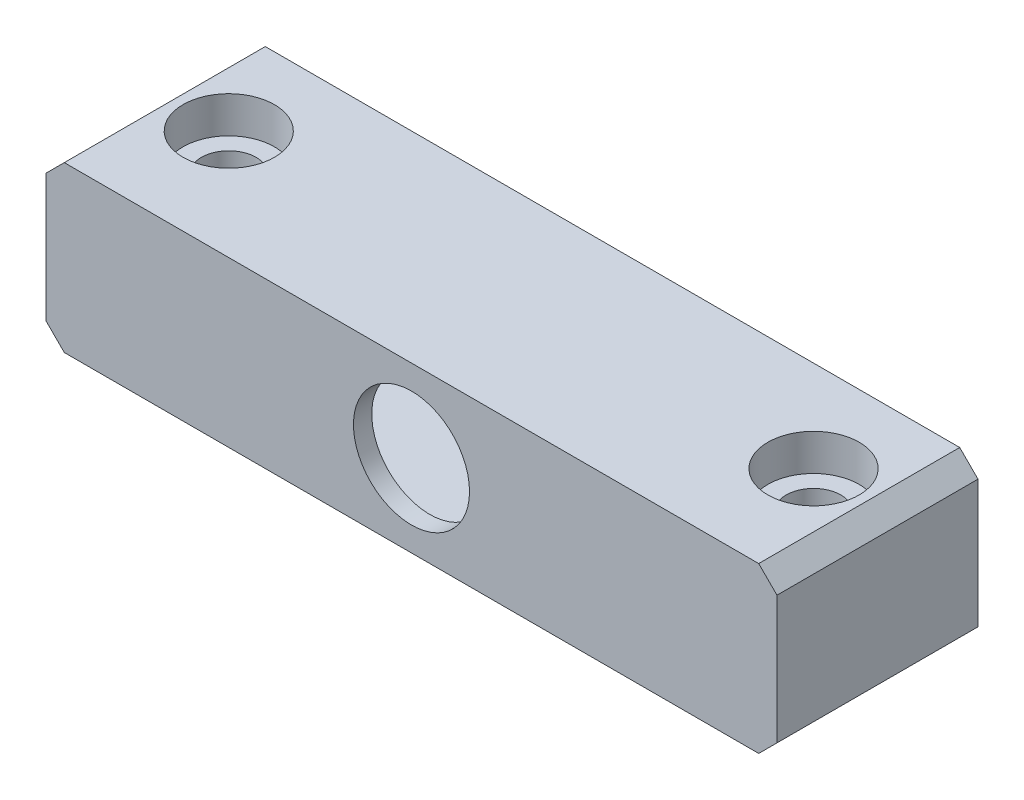
ISO-10303-21;
HEADER;
FILE_DESCRIPTION(('STEP AP214'),'2;1');
FILE_NAME('part.step','',(''),(''),'','','');
FILE_SCHEMA(('AUTOMOTIVE_DESIGN { 1 0 10303 214 1 1 1 1 }'));
ENDSEC;
DATA;
#1=APPLICATION_CONTEXT('core data for automotive mechanical design processes');
#2=APPLICATION_PROTOCOL_DEFINITION('international standard','automotive_design',2000,#1);
#3=PRODUCT_CONTEXT('',#1,'mechanical');
#4=PRODUCT('Part','Part','',(#3));
#5=PRODUCT_RELATED_PRODUCT_CATEGORY('part','',(#4));
#6=PRODUCT_DEFINITION_FORMATION('','',#4);
#7=PRODUCT_DEFINITION_CONTEXT('part definition',#1,'design');
#8=PRODUCT_DEFINITION('design','',#6,#7);
#9=PRODUCT_DEFINITION_SHAPE('','',#8);
#10=(LENGTH_UNIT() NAMED_UNIT(*) SI_UNIT(.MILLI.,.METRE.));
#11=(NAMED_UNIT(*) PLANE_ANGLE_UNIT() SI_UNIT($,.RADIAN.));
#12=(NAMED_UNIT(*) SI_UNIT($,.STERADIAN.) SOLID_ANGLE_UNIT());
#13=UNCERTAINTY_MEASURE_WITH_UNIT(LENGTH_MEASURE(1.E-05),#10,'distance_accuracy_value','');
#14=(GEOMETRIC_REPRESENTATION_CONTEXT(3) GLOBAL_UNCERTAINTY_ASSIGNED_CONTEXT((#13)) GLOBAL_UNIT_ASSIGNED_CONTEXT((#10,
#11,#12)) REPRESENTATION_CONTEXT('',''));
#15=CARTESIAN_POINT('',(0.,0.,0.));
#16=DIRECTION('',(0.,0.,1.));
#17=DIRECTION('',(1.,0.,0.));
#18=AXIS2_PLACEMENT_3D('',#15,#16,#17);
#19=CARTESIAN_POINT('',(0.,0.,-5.));
#20=DIRECTION('',(0.,0.,1.));
#21=DIRECTION('',(1.,0.,0.));
#22=AXIS2_PLACEMENT_3D('',#19,#20,#21);
#23=PLANE('',#22);
#24=DIRECTION('',(1.,0.,0.));
#25=VECTOR('',#24,1.);
#26=CARTESIAN_POINT('',(10.,-4.5,-5.));
#27=LINE('',#26,#25);
#28=CARTESIAN_POINT('',(-19.,-4.5,-5.));
#29=VERTEX_POINT('',#28);
#30=CARTESIAN_POINT('',(19.,-4.5,-5.));
#31=VERTEX_POINT('',#30);
#32=EDGE_CURVE('E184',#29,#31,#27,.T.);
#33=ORIENTED_EDGE('',*,*,#32,.F.);
#34=DIRECTION('',(0.707106781186546,-0.707106781186549,0.));
#35=VECTOR('',#34,1.);
#36=CARTESIAN_POINT('',(-19.,-4.5,-5.));
#37=LINE('',#36,#35);
#38=CARTESIAN_POINT('',(-20.,-3.49999999999999,-5.));
#39=VERTEX_POINT('',#38);
#40=EDGE_CURVE('E221',#29,#39,#37,.F.);
#41=ORIENTED_EDGE('',*,*,#40,.T.);
#42=DIRECTION('',(0.,-1.,0.));
#43=VECTOR('',#42,1.);
#44=CARTESIAN_POINT('',(-20.,4.5,-5.));
#45=LINE('',#44,#43);
#46=CARTESIAN_POINT('',(-20.,3.5,-5.));
#47=VERTEX_POINT('',#46);
#48=EDGE_CURVE('E175',#47,#39,#45,.T.);
#49=ORIENTED_EDGE('',*,*,#48,.F.);
#50=DIRECTION('',(-0.707106781186549,-0.707106781186546,0.));
#51=VECTOR('',#50,1.);
#52=CARTESIAN_POINT('',(-20.,3.5,-5.));
#53=LINE('',#52,#51);
#54=CARTESIAN_POINT('',(-19.,4.5,-5.));
#55=VERTEX_POINT('',#54);
#56=EDGE_CURVE('E212',#47,#55,#53,.F.);
#57=ORIENTED_EDGE('',*,*,#56,.T.);
#58=DIRECTION('',(-1.,0.,0.));
#59=VECTOR('',#58,1.);
#60=CARTESIAN_POINT('',(-10.,4.5,-5.));
#61=LINE('',#60,#59);
#62=CARTESIAN_POINT('',(19.,4.5,-5.));
#63=VERTEX_POINT('',#62);
#64=EDGE_CURVE('E192',#63,#55,#61,.T.);
#65=ORIENTED_EDGE('',*,*,#64,.F.);
#66=DIRECTION('',(-0.707106781186545,0.70710678118655,0.));
#67=VECTOR('',#66,1.);
#68=CARTESIAN_POINT('',(19.,4.5,-5.));
#69=LINE('',#68,#67);
#70=CARTESIAN_POINT('',(20.,3.5,-5.));
#71=VERTEX_POINT('',#70);
#72=EDGE_CURVE('E215',#63,#71,#69,.F.);
#73=ORIENTED_EDGE('',*,*,#72,.T.);
#74=DIRECTION('',(0.,1.,0.));
#75=VECTOR('',#74,1.);
#76=CARTESIAN_POINT('',(20.,-4.5,-5.));
#77=LINE('',#76,#75);
#78=CARTESIAN_POINT('',(20.,-3.50000000000001,-5.));
#79=VERTEX_POINT('',#78);
#80=EDGE_CURVE('E188',#79,#71,#77,.T.);
#81=ORIENTED_EDGE('',*,*,#80,.F.);
#82=DIRECTION('',(0.707106781186549,0.707106781186546,0.));
#83=VECTOR('',#82,1.);
#84=CARTESIAN_POINT('',(20.,-3.50000000000001,-5.));
#85=LINE('',#84,#83);
#86=EDGE_CURVE('E218',#79,#31,#85,.F.);
#87=ORIENTED_EDGE('',*,*,#86,.T.);
#88=EDGE_LOOP('',(#33,#41,#49,#57,#65,#73,#81,#87));
#89=FACE_BOUND('',#88,.T.);
#90=CARTESIAN_POINT('',(-10.,0.,-5.));
#91=DIRECTION('',(0.,0.,1.));
#92=DIRECTION('',(-1.,0.,0.));
#93=AXIS2_PLACEMENT_3D('',#90,#91,#92);
#94=CIRCLE('',#93,3.5);
#95=CARTESIAN_POINT('',(-10.,3.5,-5.));
#96=VERTEX_POINT('',#95);
#97=CARTESIAN_POINT('',(-10.,-3.5,-5.));
#98=VERTEX_POINT('',#97);
#99=EDGE_CURVE('E283',#96,#98,#94,.T.);
#100=ORIENTED_EDGE('',*,*,#99,.T.);
#101=DIRECTION('',(1.,0.,0.));
#102=VECTOR('',#101,1.);
#103=CARTESIAN_POINT('',(10.,-3.5,-5.));
#104=LINE('',#103,#102);
#105=CARTESIAN_POINT('',(10.,-3.5,-5.));
#106=VERTEX_POINT('',#105);
#107=EDGE_CURVE('E292',#98,#106,#104,.T.);
#108=ORIENTED_EDGE('',*,*,#107,.T.);
#109=CARTESIAN_POINT('',(10.,0.,-5.));
#110=DIRECTION('',(0.,0.,1.));
#111=DIRECTION('',(-1.,0.,0.));
#112=AXIS2_PLACEMENT_3D('',#109,#110,#111);
#113=CIRCLE('',#112,3.5);
#114=CARTESIAN_POINT('',(10.,3.5,-5.));
#115=VERTEX_POINT('',#114);
#116=EDGE_CURVE('E168',#106,#115,#113,.T.);
#117=ORIENTED_EDGE('',*,*,#116,.T.);
#118=DIRECTION('',(-1.,0.,0.));
#119=VECTOR('',#118,1.);
#120=CARTESIAN_POINT('',(-10.,3.5,-5.));
#121=LINE('',#120,#119);
#122=EDGE_CURVE('E285',#115,#96,#121,.T.);
#123=ORIENTED_EDGE('',*,*,#122,.T.);
#124=EDGE_LOOP('',(#100,#108,#117,#123));
#125=FACE_BOUND('',#124,.T.);
#126=ADVANCED_FACE('F53',(#89,#125),#23,.F.);
#127=CARTESIAN_POINT('',(-20.,4.5,5.));
#128=DIRECTION('',(1.,0.,0.));
#129=DIRECTION('',(0.,1.,0.));
#130=AXIS2_PLACEMENT_3D('',#127,#128,#129);
#131=PLANE('',#130);
#132=ORIENTED_EDGE('',*,*,#48,.T.);
#133=DIRECTION('',(0.,0.,1.));
#134=VECTOR('',#133,1.);
#135=CARTESIAN_POINT('',(-20.,-3.49999999999999,5.));
#136=LINE('',#135,#134);
#137=CARTESIAN_POINT('',(-20.,-3.49999999999999,6.));
#138=VERTEX_POINT('',#137);
#139=EDGE_CURVE('E228',#39,#138,#136,.T.);
#140=ORIENTED_EDGE('',*,*,#139,.T.);
#141=DIRECTION('',(0.,-1.,0.));
#142=VECTOR('',#141,1.);
#143=CARTESIAN_POINT('',(-20.,0.,6.));
#144=LINE('',#143,#142);
#145=CARTESIAN_POINT('',(-20.,3.5,6.));
#146=VERTEX_POINT('',#145);
#147=EDGE_CURVE('E269',#146,#138,#144,.T.);
#148=ORIENTED_EDGE('',*,*,#147,.F.);
#149=DIRECTION('',(0.,0.,-1.));
#150=VECTOR('',#149,1.);
#151=CARTESIAN_POINT('',(-20.,3.5,5.));
#152=LINE('',#151,#150);
#153=EDGE_CURVE('E224',#146,#47,#152,.T.);
#154=ORIENTED_EDGE('',*,*,#153,.T.);
#155=EDGE_LOOP('',(#132,#140,#148,#154));
#156=FACE_BOUND('',#155,.T.);
#157=ADVANCED_FACE('F318',(#156),#131,.F.);
#158=CARTESIAN_POINT('',(10.,-4.5,5.));
#159=DIRECTION('',(0.,1.,0.));
#160=DIRECTION('',(-1.,0.,0.));
#161=AXIS2_PLACEMENT_3D('',#158,#159,#160);
#162=PLANE('',#161);
#163=CARTESIAN_POINT('',(-16.,-4.5,0.));
#164=DIRECTION('',(0.,1.,0.));
#165=DIRECTION('',(0.,0.,1.));
#166=AXIS2_PLACEMENT_3D('',#163,#164,#165);
#167=CIRCLE('',#166,1.5);
#168=CARTESIAN_POINT('',(-16.,-4.5,1.5));
#169=VERTEX_POINT('',#168);
#170=EDGE_CURVE('E201',#169,#169,#167,.T.);
#171=ORIENTED_EDGE('',*,*,#170,.T.);
#172=EDGE_LOOP('',(#171));
#173=FACE_BOUND('',#172,.T.);
#174=CARTESIAN_POINT('',(16.,-4.5,0.));
#175=DIRECTION('',(0.,1.,0.));
#176=DIRECTION('',(0.,0.,1.));
#177=AXIS2_PLACEMENT_3D('',#174,#175,#176);
#178=CIRCLE('',#177,1.5);
#179=CARTESIAN_POINT('',(16.,-4.5,1.5));
#180=VERTEX_POINT('',#179);
#181=EDGE_CURVE('E614',#180,#180,#178,.T.);
#182=ORIENTED_EDGE('',*,*,#181,.T.);
#183=EDGE_LOOP('',(#182));
#184=FACE_BOUND('',#183,.T.);
#185=DIRECTION('',(1.,0.,0.));
#186=VECTOR('',#185,1.);
#187=CARTESIAN_POINT('',(0.,-4.5,6.));
#188=LINE('',#187,#186);
#189=CARTESIAN_POINT('',(-19.,-4.5,6.));
#190=VERTEX_POINT('',#189);
#191=CARTESIAN_POINT('',(19.,-4.5,6.));
#192=VERTEX_POINT('',#191);
#193=EDGE_CURVE('E274',#190,#192,#188,.T.);
#194=ORIENTED_EDGE('',*,*,#193,.F.);
#195=DIRECTION('',(0.,0.,-1.));
#196=VECTOR('',#195,1.);
#197=CARTESIAN_POINT('',(-19.,-4.5,5.));
#198=LINE('',#197,#196);
#199=EDGE_CURVE('E208',#190,#29,#198,.T.);
#200=ORIENTED_EDGE('',*,*,#199,.T.);
#201=ORIENTED_EDGE('',*,*,#32,.T.);
#202=DIRECTION('',(0.,0.,1.));
#203=VECTOR('',#202,1.);
#204=CARTESIAN_POINT('',(19.,-4.5,5.));
#205=LINE('',#204,#203);
#206=EDGE_CURVE('E195',#31,#192,#205,.T.);
#207=ORIENTED_EDGE('',*,*,#206,.T.);
#208=EDGE_LOOP('',(#194,#200,#201,#207));
#209=FACE_BOUND('',#208,.T.);
#210=ADVANCED_FACE('F322',(#173,#184,#209),#162,.F.);
#211=CARTESIAN_POINT('',(20.,-4.5,5.));
#212=DIRECTION('',(-1.,0.,0.));
#213=DIRECTION('',(0.,-1.,0.));
#214=AXIS2_PLACEMENT_3D('',#211,#212,#213);
#215=PLANE('',#214);
#216=DIRECTION('',(0.,1.,0.));
#217=VECTOR('',#216,1.);
#218=CARTESIAN_POINT('',(20.,0.,6.));
#219=LINE('',#218,#217);
#220=CARTESIAN_POINT('',(20.,-3.50000000000001,6.));
#221=VERTEX_POINT('',#220);
#222=CARTESIAN_POINT('',(20.,3.5,6.));
#223=VERTEX_POINT('',#222);
#224=EDGE_CURVE('E255',#221,#223,#219,.T.);
#225=ORIENTED_EDGE('',*,*,#224,.F.);
#226=DIRECTION('',(0.,0.,-1.));
#227=VECTOR('',#226,1.);
#228=CARTESIAN_POINT('',(20.,-3.50000000000001,5.));
#229=LINE('',#228,#227);
#230=EDGE_CURVE('E245',#221,#79,#229,.T.);
#231=ORIENTED_EDGE('',*,*,#230,.T.);
#232=ORIENTED_EDGE('',*,*,#80,.T.);
#233=DIRECTION('',(0.,0.,1.));
#234=VECTOR('',#233,1.);
#235=CARTESIAN_POINT('',(20.,3.5,5.));
#236=LINE('',#235,#234);
#237=EDGE_CURVE('E242',#71,#223,#236,.T.);
#238=ORIENTED_EDGE('',*,*,#237,.T.);
#239=EDGE_LOOP('',(#225,#231,#232,#238));
#240=FACE_BOUND('',#239,.T.);
#241=ADVANCED_FACE('F253',(#240),#215,.F.);
#242=CARTESIAN_POINT('',(-10.,4.5,5.));
#243=DIRECTION('',(0.,-1.,0.));
#244=DIRECTION('',(0.,0.,-1.));
#245=AXIS2_PLACEMENT_3D('',#242,#243,#244);
#246=PLANE('',#245);
#247=CARTESIAN_POINT('',(16.,4.5,0.));
#248=DIRECTION('',(0.,1.,0.));
#249=DIRECTION('',(0.,0.,1.));
#250=AXIS2_PLACEMENT_3D('',#247,#248,#249);
#251=CIRCLE('',#250,2.5);
#252=CARTESIAN_POINT('',(16.,4.5,2.5));
#253=VERTEX_POINT('',#252);
#254=EDGE_CURVE('E625',#253,#253,#251,.T.);
#255=ORIENTED_EDGE('',*,*,#254,.F.);
#256=EDGE_LOOP('',(#255));
#257=FACE_BOUND('',#256,.T.);
#258=CARTESIAN_POINT('',(-16.,4.5,0.));
#259=DIRECTION('',(0.,1.,0.));
#260=DIRECTION('',(0.,0.,1.));
#261=AXIS2_PLACEMENT_3D('',#258,#259,#260);
#262=CIRCLE('',#261,2.5);
#263=CARTESIAN_POINT('',(-16.,4.5,2.5));
#264=VERTEX_POINT('',#263);
#265=EDGE_CURVE('E629',#264,#264,#262,.T.);
#266=ORIENTED_EDGE('',*,*,#265,.F.);
#267=EDGE_LOOP('',(#266));
#268=FACE_BOUND('',#267,.T.);
#269=DIRECTION('',(-1.,0.,0.));
#270=VECTOR('',#269,1.);
#271=CARTESIAN_POINT('',(0.,4.50000000000001,6.));
#272=LINE('',#271,#270);
#273=CARTESIAN_POINT('',(19.,4.5,6.));
#274=VERTEX_POINT('',#273);
#275=CARTESIAN_POINT('',(-19.,4.50000000000002,6.));
#276=VERTEX_POINT('',#275);
#277=EDGE_CURVE('E266',#274,#276,#272,.T.);
#278=ORIENTED_EDGE('',*,*,#277,.F.);
#279=DIRECTION('',(0.,0.,-1.));
#280=VECTOR('',#279,1.);
#281=CARTESIAN_POINT('',(19.,4.5,5.));
#282=LINE('',#281,#280);
#283=EDGE_CURVE('E12',#274,#63,#282,.T.);
#284=ORIENTED_EDGE('',*,*,#283,.T.);
#285=ORIENTED_EDGE('',*,*,#64,.T.);
#286=DIRECTION('',(0.,0.,1.));
#287=VECTOR('',#286,1.);
#288=CARTESIAN_POINT('',(-19.,4.5,5.));
#289=LINE('',#288,#287);
#290=EDGE_CURVE('E63',#55,#276,#289,.T.);
#291=ORIENTED_EDGE('',*,*,#290,.T.);
#292=EDGE_LOOP('',(#278,#284,#285,#291));
#293=FACE_BOUND('',#292,.T.);
#294=ADVANCED_FACE('F265',(#257,#268,#293),#246,.F.);
#295=CARTESIAN_POINT('',(-10.,0.,5.));
#296=DIRECTION('',(0.,0.,-1.));
#297=DIRECTION('',(-1.,0.,0.));
#298=AXIS2_PLACEMENT_3D('',#295,#296,#297);
#299=CYLINDRICAL_SURFACE('',#298,3.5);
#300=ORIENTED_EDGE('',*,*,#99,.F.);
#301=DIRECTION('',(0.,0.,-1.));
#302=VECTOR('',#301,1.);
#303=CARTESIAN_POINT('',(-10.,3.5,5.));
#304=LINE('',#303,#302);
#305=CARTESIAN_POINT('',(-10.,3.5,5.));
#306=VERTEX_POINT('',#305);
#307=EDGE_CURVE('E177',#306,#96,#304,.T.);
#308=ORIENTED_EDGE('',*,*,#307,.F.);
#309=CARTESIAN_POINT('',(-10.,0.,5.));
#310=DIRECTION('',(0.,0.,1.));
#311=DIRECTION('',(-1.,0.,0.));
#312=AXIS2_PLACEMENT_3D('',#309,#310,#311);
#313=CIRCLE('',#312,3.5);
#314=CARTESIAN_POINT('',(-10.,-3.5,5.));
#315=VERTEX_POINT('',#314);
#316=EDGE_CURVE('E164',#306,#315,#313,.T.);
#317=ORIENTED_EDGE('',*,*,#316,.T.);
#318=DIRECTION('',(0.,0.,-1.));
#319=VECTOR('',#318,1.);
#320=CARTESIAN_POINT('',(-10.,-3.5,5.));
#321=LINE('',#320,#319);
#322=EDGE_CURVE('E162',#315,#98,#321,.T.);
#323=ORIENTED_EDGE('',*,*,#322,.T.);
#324=EDGE_LOOP('',(#300,#308,#317,#323));
#325=FACE_BOUND('',#324,.T.);
#326=ADVANCED_FACE('F306',(#325),#299,.F.);
#327=CARTESIAN_POINT('',(10.,-3.5,5.));
#328=DIRECTION('',(0.,1.,0.));
#329=DIRECTION('',(0.,0.,1.));
#330=AXIS2_PLACEMENT_3D('',#327,#328,#329);
#331=PLANE('',#330);
#332=ORIENTED_EDGE('',*,*,#107,.F.);
#333=ORIENTED_EDGE('',*,*,#322,.F.);
#334=DIRECTION('',(1.,0.,0.));
#335=VECTOR('',#334,1.);
#336=CARTESIAN_POINT('',(10.,-3.5,5.));
#337=LINE('',#336,#335);
#338=CARTESIAN_POINT('',(10.,-3.5,5.));
#339=VERTEX_POINT('',#338);
#340=EDGE_CURVE('E147',#315,#339,#337,.T.);
#341=ORIENTED_EDGE('',*,*,#340,.T.);
#342=DIRECTION('',(0.,0.,-1.));
#343=VECTOR('',#342,1.);
#344=CARTESIAN_POINT('',(10.,-3.5,5.));
#345=LINE('',#344,#343);
#346=EDGE_CURVE('E159',#339,#106,#345,.T.);
#347=ORIENTED_EDGE('',*,*,#346,.T.);
#348=EDGE_LOOP('',(#332,#333,#341,#347));
#349=FACE_BOUND('',#348,.T.);
#350=ADVANCED_FACE('F158',(#349),#331,.T.);
#351=CARTESIAN_POINT('',(10.,0.,5.));
#352=DIRECTION('',(0.,0.,-1.));
#353=DIRECTION('',(-1.,0.,0.));
#354=AXIS2_PLACEMENT_3D('',#351,#352,#353);
#355=CYLINDRICAL_SURFACE('',#354,3.5);
#356=ORIENTED_EDGE('',*,*,#116,.F.);
#357=ORIENTED_EDGE('',*,*,#346,.F.);
#358=CARTESIAN_POINT('',(10.,0.,5.));
#359=DIRECTION('',(0.,0.,1.));
#360=DIRECTION('',(-1.,0.,0.));
#361=AXIS2_PLACEMENT_3D('',#358,#359,#360);
#362=CIRCLE('',#361,3.5);
#363=CARTESIAN_POINT('',(10.,3.5,5.));
#364=VERTEX_POINT('',#363);
#365=EDGE_CURVE('E144',#339,#364,#362,.T.);
#366=ORIENTED_EDGE('',*,*,#365,.T.);
#367=DIRECTION('',(0.,0.,-1.));
#368=VECTOR('',#367,1.);
#369=CARTESIAN_POINT('',(10.,3.5,5.));
#370=LINE('',#369,#368);
#371=EDGE_CURVE('E171',#364,#115,#370,.T.);
#372=ORIENTED_EDGE('',*,*,#371,.T.);
#373=EDGE_LOOP('',(#356,#357,#366,#372));
#374=FACE_BOUND('',#373,.T.);
#375=ADVANCED_FACE('F166',(#374),#355,.F.);
#376=CARTESIAN_POINT('',(-10.,3.5,5.));
#377=DIRECTION('',(0.,-1.,0.));
#378=DIRECTION('',(1.,0.,0.));
#379=AXIS2_PLACEMENT_3D('',#376,#377,#378);
#380=PLANE('',#379);
#381=ORIENTED_EDGE('',*,*,#122,.F.);
#382=ORIENTED_EDGE('',*,*,#371,.F.);
#383=DIRECTION('',(-1.,0.,0.));
#384=VECTOR('',#383,1.);
#385=CARTESIAN_POINT('',(-10.,3.5,5.));
#386=LINE('',#385,#384);
#387=EDGE_CURVE('E150',#364,#306,#386,.T.);
#388=ORIENTED_EDGE('',*,*,#387,.T.);
#389=ORIENTED_EDGE('',*,*,#307,.T.);
#390=EDGE_LOOP('',(#381,#382,#388,#389));
#391=FACE_BOUND('',#390,.T.);
#392=ADVANCED_FACE('F304',(#391),#380,.T.);
#393=CARTESIAN_POINT('',(0.,0.,5.));
#394=DIRECTION('',(0.,0.,1.));
#395=DIRECTION('',(1.,0.,0.));
#396=AXIS2_PLACEMENT_3D('',#393,#394,#395);
#397=PLANE('',#396);
#398=CARTESIAN_POINT('',(0.,0.,5.));
#399=DIRECTION('',(0.,0.,1.));
#400=DIRECTION('',(1.,0.,0.));
#401=AXIS2_PLACEMENT_3D('',#398,#399,#400);
#402=CIRCLE('',#401,3.175);
#403=CARTESIAN_POINT('',(3.175,0.,5.));
#404=VERTEX_POINT('',#403);
#405=EDGE_CURVE('E276',#404,#404,#402,.F.);
#406=ORIENTED_EDGE('',*,*,#405,.F.);
#407=EDGE_LOOP('',(#406));
#408=FACE_BOUND('',#407,.T.);
#409=ORIENTED_EDGE('',*,*,#340,.F.);
#410=ORIENTED_EDGE('',*,*,#316,.F.);
#411=ORIENTED_EDGE('',*,*,#387,.F.);
#412=ORIENTED_EDGE('',*,*,#365,.F.);
#413=EDGE_LOOP('',(#409,#410,#411,#412));
#414=FACE_BOUND('',#413,.T.);
#415=ADVANCED_FACE('F146',(#408,#414),#397,.F.);
#416=CARTESIAN_POINT('',(0.,0.,6.));
#417=DIRECTION('',(0.,0.,1.));
#418=DIRECTION('',(1.,0.,0.));
#419=AXIS2_PLACEMENT_3D('',#416,#417,#418);
#420=PLANE('',#419);
#421=CARTESIAN_POINT('',(0.,0.,6.));
#422=DIRECTION('',(0.,0.,1.));
#423=DIRECTION('',(1.,0.,0.));
#424=AXIS2_PLACEMENT_3D('',#421,#422,#423);
#425=CIRCLE('',#424,3.175);
#426=CARTESIAN_POINT('',(3.175,0.,6.));
#427=VERTEX_POINT('',#426);
#428=EDGE_CURVE('E624',#427,#427,#425,.T.);
#429=ORIENTED_EDGE('',*,*,#428,.F.);
#430=EDGE_LOOP('',(#429));
#431=FACE_BOUND('',#430,.T.);
#432=ORIENTED_EDGE('',*,*,#147,.T.);
#433=DIRECTION('',(-0.707106781186546,0.707106781186549,0.));
#434=VECTOR('',#433,1.);
#435=CARTESIAN_POINT('',(-11.75,-11.75,6.));
#436=LINE('',#435,#434);
#437=EDGE_CURVE('E239',#138,#190,#436,.F.);
#438=ORIENTED_EDGE('',*,*,#437,.T.);
#439=ORIENTED_EDGE('',*,*,#193,.T.);
#440=DIRECTION('',(-0.707106781186549,-0.707106781186546,0.));
#441=VECTOR('',#440,1.);
#442=CARTESIAN_POINT('',(11.75,-11.75,6.));
#443=LINE('',#442,#441);
#444=EDGE_CURVE('E236',#192,#221,#443,.F.);
#445=ORIENTED_EDGE('',*,*,#444,.T.);
#446=ORIENTED_EDGE('',*,*,#224,.T.);
#447=DIRECTION('',(0.707106781186545,-0.70710678118655,0.));
#448=VECTOR('',#447,1.);
#449=CARTESIAN_POINT('',(11.7500000000001,11.75,6.));
#450=LINE('',#449,#448);
#451=EDGE_CURVE('E76',#223,#274,#450,.F.);
#452=ORIENTED_EDGE('',*,*,#451,.T.);
#453=ORIENTED_EDGE('',*,*,#277,.T.);
#454=DIRECTION('',(0.707106781186549,0.707106781186546,0.));
#455=VECTOR('',#454,1.);
#456=CARTESIAN_POINT('',(-11.75,11.75,6.));
#457=LINE('',#456,#455);
#458=EDGE_CURVE('E231',#276,#146,#457,.F.);
#459=ORIENTED_EDGE('',*,*,#458,.T.);
#460=EDGE_LOOP('',(#432,#438,#439,#445,#446,#452,#453,#459));
#461=FACE_BOUND('',#460,.T.);
#462=ADVANCED_FACE('F356',(#431,#461),#420,.T.);
#463=CARTESIAN_POINT('',(0.,0.,-5.001));
#464=DIRECTION('',(0.,0.,1.));
#465=DIRECTION('',(1.,0.,0.));
#466=AXIS2_PLACEMENT_3D('',#463,#464,#465);
#467=CYLINDRICAL_SURFACE('',#466,3.175);
#468=ORIENTED_EDGE('',*,*,#428,.T.);
#469=EDGE_LOOP('',(#468));
#470=FACE_BOUND('',#469,.T.);
#471=ORIENTED_EDGE('',*,*,#405,.T.);
#472=EDGE_LOOP('',(#471));
#473=FACE_BOUND('',#472,.T.);
#474=ADVANCED_FACE('F365',(#470,#473),#467,.F.);
#475=CARTESIAN_POINT('',(-16.,2.5,0.));
#476=DIRECTION('',(0.,1.,0.));
#477=DIRECTION('',(0.,0.,1.));
#478=AXIS2_PLACEMENT_3D('',#475,#476,#477);
#479=CYLINDRICAL_SURFACE('',#478,2.5);
#480=CARTESIAN_POINT('',(-16.,2.5,0.));
#481=DIRECTION('',(0.,1.,0.));
#482=DIRECTION('',(0.,0.,1.));
#483=AXIS2_PLACEMENT_3D('',#480,#481,#482);
#484=CIRCLE('',#483,2.5);
#485=CARTESIAN_POINT('',(-16.,2.5,2.5));
#486=VERTEX_POINT('',#485);
#487=EDGE_CURVE('E205',#486,#486,#484,.T.);
#488=ORIENTED_EDGE('',*,*,#487,.F.);
#489=EDGE_LOOP('',(#488));
#490=FACE_BOUND('',#489,.T.);
#491=ORIENTED_EDGE('',*,*,#265,.T.);
#492=EDGE_LOOP('',(#491));
#493=FACE_BOUND('',#492,.T.);
#494=ADVANCED_FACE('F372',(#490,#493),#479,.F.);
#495=CARTESIAN_POINT('',(0.,2.5,0.));
#496=DIRECTION('',(0.,1.,0.));
#497=DIRECTION('',(0.,0.,1.));
#498=AXIS2_PLACEMENT_3D('',#495,#496,#497);
#499=PLANE('',#498);
#500=CARTESIAN_POINT('',(-16.,2.5,0.));
#501=DIRECTION('',(0.,1.,0.));
#502=DIRECTION('',(0.,0.,1.));
#503=AXIS2_PLACEMENT_3D('',#500,#501,#502);
#504=CIRCLE('',#503,1.5);
#505=CARTESIAN_POINT('',(-16.,2.5,1.5));
#506=VERTEX_POINT('',#505);
#507=EDGE_CURVE('E200',#506,#506,#504,.T.);
#508=ORIENTED_EDGE('',*,*,#507,.F.);
#509=EDGE_LOOP('',(#508));
#510=FACE_BOUND('',#509,.T.);
#511=ORIENTED_EDGE('',*,*,#487,.T.);
#512=EDGE_LOOP('',(#511));
#513=FACE_BOUND('',#512,.T.);
#514=ADVANCED_FACE('F415',(#510,#513),#499,.T.);
#515=CARTESIAN_POINT('',(16.,2.5,0.));
#516=DIRECTION('',(0.,1.,0.));
#517=DIRECTION('',(0.,0.,1.));
#518=AXIS2_PLACEMENT_3D('',#515,#516,#517);
#519=CYLINDRICAL_SURFACE('',#518,2.5);
#520=CARTESIAN_POINT('',(16.,2.5,0.));
#521=DIRECTION('',(0.,1.,0.));
#522=DIRECTION('',(0.,0.,1.));
#523=AXIS2_PLACEMENT_3D('',#520,#521,#522);
#524=CIRCLE('',#523,2.5);
#525=CARTESIAN_POINT('',(16.,2.5,2.5));
#526=VERTEX_POINT('',#525);
#527=EDGE_CURVE('E620',#526,#526,#524,.T.);
#528=ORIENTED_EDGE('',*,*,#527,.F.);
#529=EDGE_LOOP('',(#528));
#530=FACE_BOUND('',#529,.T.);
#531=ORIENTED_EDGE('',*,*,#254,.T.);
#532=EDGE_LOOP('',(#531));
#533=FACE_BOUND('',#532,.T.);
#534=ADVANCED_FACE('F423',(#530,#533),#519,.F.);
#535=CARTESIAN_POINT('',(0.,2.5,0.));
#536=DIRECTION('',(0.,1.,0.));
#537=DIRECTION('',(0.,0.,1.));
#538=AXIS2_PLACEMENT_3D('',#535,#536,#537);
#539=PLANE('',#538);
#540=CARTESIAN_POINT('',(16.,2.5,0.));
#541=DIRECTION('',(0.,1.,0.));
#542=DIRECTION('',(0.,0.,1.));
#543=AXIS2_PLACEMENT_3D('',#540,#541,#542);
#544=CIRCLE('',#543,1.5);
#545=CARTESIAN_POINT('',(16.,2.5,1.5));
#546=VERTEX_POINT('',#545);
#547=EDGE_CURVE('E196',#546,#546,#544,.T.);
#548=ORIENTED_EDGE('',*,*,#547,.F.);
#549=EDGE_LOOP('',(#548));
#550=FACE_BOUND('',#549,.T.);
#551=ORIENTED_EDGE('',*,*,#527,.T.);
#552=EDGE_LOOP('',(#551));
#553=FACE_BOUND('',#552,.T.);
#554=ADVANCED_FACE('F428',(#550,#553),#539,.T.);
#555=CARTESIAN_POINT('',(16.,-4.5,0.));
#556=DIRECTION('',(0.,1.,0.));
#557=DIRECTION('',(0.,0.,1.));
#558=AXIS2_PLACEMENT_3D('',#555,#556,#557);
#559=CYLINDRICAL_SURFACE('',#558,1.5);
#560=ORIENTED_EDGE('',*,*,#547,.T.);
#561=EDGE_LOOP('',(#560));
#562=FACE_BOUND('',#561,.T.);
#563=ORIENTED_EDGE('',*,*,#181,.F.);
#564=EDGE_LOOP('',(#563));
#565=FACE_BOUND('',#564,.T.);
#566=ADVANCED_FACE('F446',(#562,#565),#559,.F.);
#567=CARTESIAN_POINT('',(-16.,-4.5,0.));
#568=DIRECTION('',(0.,1.,0.));
#569=DIRECTION('',(0.,0.,1.));
#570=AXIS2_PLACEMENT_3D('',#567,#568,#569);
#571=CYLINDRICAL_SURFACE('',#570,1.5);
#572=ORIENTED_EDGE('',*,*,#507,.T.);
#573=EDGE_LOOP('',(#572));
#574=FACE_BOUND('',#573,.T.);
#575=ORIENTED_EDGE('',*,*,#170,.F.);
#576=EDGE_LOOP('',(#575));
#577=FACE_BOUND('',#576,.T.);
#578=ADVANCED_FACE('F339',(#574,#577),#571,.F.);
#579=CARTESIAN_POINT('',(-19.,-4.5,5.));
#580=DIRECTION('',(0.707106781186549,0.707106781186546,0.));
#581=DIRECTION('',(0.,0.,-1.));
#582=AXIS2_PLACEMENT_3D('',#579,#580,#581);
#583=PLANE('',#582);
#584=ORIENTED_EDGE('',*,*,#437,.F.);
#585=ORIENTED_EDGE('',*,*,#139,.F.);
#586=ORIENTED_EDGE('',*,*,#40,.F.);
#587=ORIENTED_EDGE('',*,*,#199,.F.);
#588=EDGE_LOOP('',(#584,#585,#586,#587));
#589=FACE_BOUND('',#588,.T.);
#590=ADVANCED_FACE('F332',(#589),#583,.F.);
#591=CARTESIAN_POINT('',(20.,-3.50000000000001,5.));
#592=DIRECTION('',(-0.707106781186546,0.707106781186549,0.));
#593=DIRECTION('',(0.,0.,-1.));
#594=AXIS2_PLACEMENT_3D('',#591,#592,#593);
#595=PLANE('',#594);
#596=ORIENTED_EDGE('',*,*,#444,.F.);
#597=ORIENTED_EDGE('',*,*,#206,.F.);
#598=ORIENTED_EDGE('',*,*,#86,.F.);
#599=ORIENTED_EDGE('',*,*,#230,.F.);
#600=EDGE_LOOP('',(#596,#597,#598,#599));
#601=FACE_BOUND('',#600,.T.);
#602=ADVANCED_FACE('F338',(#601),#595,.F.);
#603=CARTESIAN_POINT('',(19.,4.5,5.));
#604=DIRECTION('',(-0.70710678118655,-0.707106781186545,0.));
#605=DIRECTION('',(0.,0.,-1.));
#606=AXIS2_PLACEMENT_3D('',#603,#604,#605);
#607=PLANE('',#606);
#608=ORIENTED_EDGE('',*,*,#451,.F.);
#609=ORIENTED_EDGE('',*,*,#237,.F.);
#610=ORIENTED_EDGE('',*,*,#72,.F.);
#611=ORIENTED_EDGE('',*,*,#283,.F.);
#612=EDGE_LOOP('',(#608,#609,#610,#611));
#613=FACE_BOUND('',#612,.T.);
#614=ADVANCED_FACE('F264',(#613),#607,.F.);
#615=CARTESIAN_POINT('',(-20.,3.5,5.));
#616=DIRECTION('',(0.707106781186546,-0.707106781186549,0.));
#617=DIRECTION('',(0.,0.,-1.));
#618=AXIS2_PLACEMENT_3D('',#615,#616,#617);
#619=PLANE('',#618);
#620=ORIENTED_EDGE('',*,*,#458,.F.);
#621=ORIENTED_EDGE('',*,*,#290,.F.);
#622=ORIENTED_EDGE('',*,*,#56,.F.);
#623=ORIENTED_EDGE('',*,*,#153,.F.);
#624=EDGE_LOOP('',(#620,#621,#622,#623));
#625=FACE_BOUND('',#624,.T.);
#626=ADVANCED_FACE('F56',(#625),#619,.F.);
#627=CLOSED_SHELL('',(#126,#157,#210,#241,#294,#326,#350,#375,#392,#415,#462,#474,#494,#514,
#534,#554,#566,#578,#590,#602,#614,#626));
#628=MANIFOLD_SOLID_BREP('B2',#627);
#629=ADVANCED_BREP_SHAPE_REPRESENTATION('',(#18,#628),#14);
#630=SHAPE_DEFINITION_REPRESENTATION(#9,#629);
ENDSEC;
END-ISO-10303-21;
